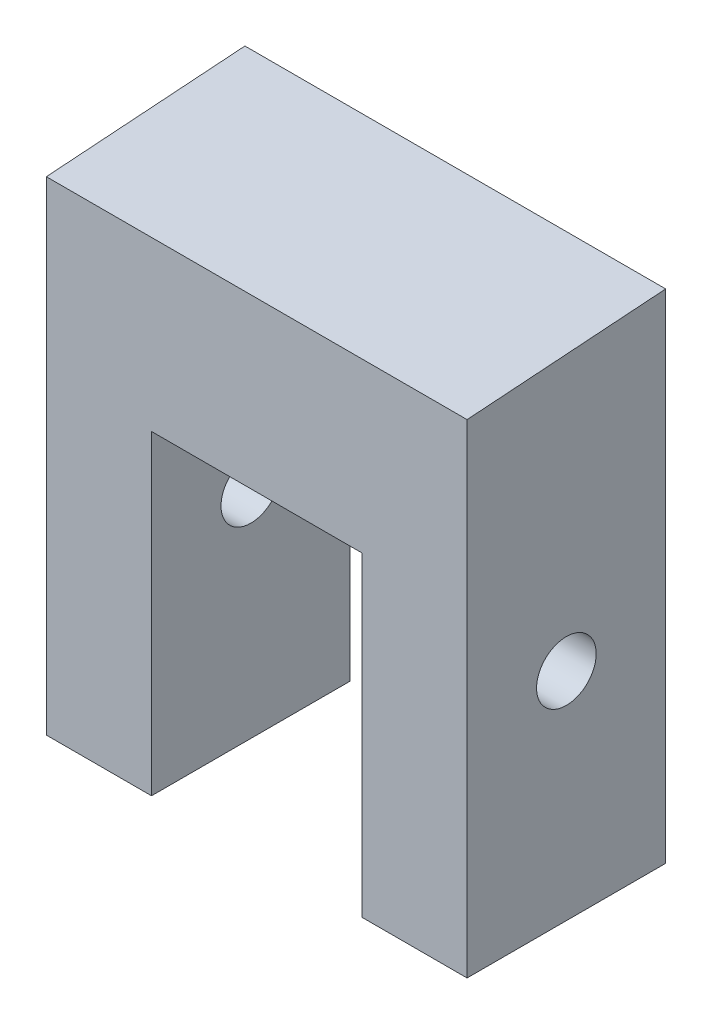
ISO-10303-21;
HEADER;
FILE_DESCRIPTION(('STEP AP214'),'2;1');
FILE_NAME('part.step','',(''),(''),'','','');
FILE_SCHEMA(('AUTOMOTIVE_DESIGN { 1 0 10303 214 1 1 1 1 }'));
ENDSEC;
DATA;
#1=APPLICATION_CONTEXT('core data for automotive mechanical design processes');
#2=APPLICATION_PROTOCOL_DEFINITION('international standard','automotive_design',2000,#1);
#3=PRODUCT_CONTEXT('',#1,'mechanical');
#4=PRODUCT('Part','Part','',(#3));
#5=PRODUCT_RELATED_PRODUCT_CATEGORY('part','',(#4));
#6=PRODUCT_DEFINITION_FORMATION('','',#4);
#7=PRODUCT_DEFINITION_CONTEXT('part definition',#1,'design');
#8=PRODUCT_DEFINITION('design','',#6,#7);
#9=PRODUCT_DEFINITION_SHAPE('','',#8);
#10=(LENGTH_UNIT() NAMED_UNIT(*) SI_UNIT(.MILLI.,.METRE.));
#11=(NAMED_UNIT(*) PLANE_ANGLE_UNIT() SI_UNIT($,.RADIAN.));
#12=(NAMED_UNIT(*) SI_UNIT($,.STERADIAN.) SOLID_ANGLE_UNIT());
#13=UNCERTAINTY_MEASURE_WITH_UNIT(LENGTH_MEASURE(1.E-05),#10,'distance_accuracy_value','');
#14=(GEOMETRIC_REPRESENTATION_CONTEXT(3) GLOBAL_UNCERTAINTY_ASSIGNED_CONTEXT((#13)) GLOBAL_UNIT_ASSIGNED_CONTEXT((#10,
#11,#12)) REPRESENTATION_CONTEXT('',''));
#15=CARTESIAN_POINT('',(0.,0.,0.));
#16=DIRECTION('',(0.,0.,1.));
#17=DIRECTION('',(1.,0.,0.));
#18=AXIS2_PLACEMENT_3D('',#15,#16,#17);
#19=CARTESIAN_POINT('',(25.4,0.,0.));
#20=DIRECTION('',(0.,1.,0.));
#21=DIRECTION('',(0.,0.,1.));
#22=AXIS2_PLACEMENT_3D('',#19,#20,#21);
#23=PLANE('',#22);
#24=DIRECTION('',(-1.,0.,0.));
#25=VECTOR('',#24,1.);
#26=CARTESIAN_POINT('',(25.4,0.,0.));
#27=LINE('',#26,#25);
#28=CARTESIAN_POINT('',(25.4,0.,0.));
#29=VERTEX_POINT('',#28);
#30=CARTESIAN_POINT('',(19.05,0.,0.));
#31=VERTEX_POINT('',#30);
#32=EDGE_CURVE('E11',#29,#31,#27,.T.);
#33=ORIENTED_EDGE('',*,*,#32,.T.);
#34=DIRECTION('',(0.,0.,1.));
#35=VECTOR('',#34,1.);
#36=CARTESIAN_POINT('',(19.05,0.,-11.9888));
#37=LINE('',#36,#35);
#38=CARTESIAN_POINT('',(19.05,0.,-11.9888));
#39=VERTEX_POINT('',#38);
#40=EDGE_CURVE('E153',#39,#31,#37,.T.);
#41=ORIENTED_EDGE('',*,*,#40,.F.);
#42=DIRECTION('',(-1.,0.,0.));
#43=VECTOR('',#42,1.);
#44=CARTESIAN_POINT('',(25.4,0.,-11.9888));
#45=LINE('',#44,#43);
#46=CARTESIAN_POINT('',(25.4,0.,-11.9888));
#47=VERTEX_POINT('',#46);
#48=EDGE_CURVE('E136',#47,#39,#45,.T.);
#49=ORIENTED_EDGE('',*,*,#48,.F.);
#50=DIRECTION('',(0.,0.,-1.));
#51=VECTOR('',#50,1.);
#52=CARTESIAN_POINT('',(25.4,0.,0.));
#53=LINE('',#52,#51);
#54=EDGE_CURVE('E92',#29,#47,#53,.T.);
#55=ORIENTED_EDGE('',*,*,#54,.F.);
#56=EDGE_LOOP('',(#33,#41,#49,#55));
#57=FACE_BOUND('',#56,.T.);
#58=ADVANCED_FACE('F39',(#57),#23,.F.);
#59=CARTESIAN_POINT('',(25.4,29.1944437645599,0.));
#60=DIRECTION('',(0.,0.,-1.));
#61=DIRECTION('',(0.,1.,0.));
#62=AXIS2_PLACEMENT_3D('',#59,#60,#61);
#63=PLANE('',#62);
#64=DIRECTION('',(-1.,0.,0.));
#65=VECTOR('',#64,1.);
#66=CARTESIAN_POINT('',(6.34999999999999,19.05,0.));
#67=LINE('',#66,#65);
#68=CARTESIAN_POINT('',(19.05,19.05,0.));
#69=VERTEX_POINT('',#68);
#70=CARTESIAN_POINT('',(6.34999999999999,19.05,0.));
#71=VERTEX_POINT('',#70);
#72=EDGE_CURVE('E141',#69,#71,#67,.T.);
#73=ORIENTED_EDGE('',*,*,#72,.F.);
#74=DIRECTION('',(0.,1.,0.));
#75=VECTOR('',#74,1.);
#76=CARTESIAN_POINT('',(19.05,19.05,0.));
#77=LINE('',#76,#75);
#78=EDGE_CURVE('E120',#31,#69,#77,.T.);
#79=ORIENTED_EDGE('',*,*,#78,.F.);
#80=ORIENTED_EDGE('',*,*,#32,.F.);
#81=DIRECTION('',(0.,-1.,0.));
#82=VECTOR('',#81,1.);
#83=CARTESIAN_POINT('',(25.4,29.1944437645599,0.));
#84=LINE('',#83,#82);
#85=CARTESIAN_POINT('',(25.4,29.1944437645599,0.));
#86=VERTEX_POINT('',#85);
#87=EDGE_CURVE('E163',#86,#29,#84,.T.);
#88=ORIENTED_EDGE('',*,*,#87,.F.);
#89=DIRECTION('',(-1.,0.,0.));
#90=VECTOR('',#89,1.);
#91=CARTESIAN_POINT('',(25.4,29.1944437645599,0.));
#92=LINE('',#91,#90);
#93=CARTESIAN_POINT('',(0.,29.1944437645599,0.));
#94=VERTEX_POINT('',#93);
#95=EDGE_CURVE('E173',#86,#94,#92,.T.);
#96=ORIENTED_EDGE('',*,*,#95,.T.);
#97=DIRECTION('',(0.,-1.,0.));
#98=VECTOR('',#97,1.);
#99=CARTESIAN_POINT('',(0.,29.1944437645599,0.));
#100=LINE('',#99,#98);
#101=CARTESIAN_POINT('',(0.,0.,0.));
#102=VERTEX_POINT('',#101);
#103=EDGE_CURVE('E156',#94,#102,#100,.T.);
#104=ORIENTED_EDGE('',*,*,#103,.T.);
#105=CARTESIAN_POINT('',(6.35,0.,0.));
#106=VERTEX_POINT('',#105);
#107=EDGE_CURVE('E48',#106,#102,#27,.T.);
#108=ORIENTED_EDGE('',*,*,#107,.F.);
#109=DIRECTION('',(0.,-1.,0.));
#110=VECTOR('',#109,1.);
#111=CARTESIAN_POINT('',(6.34999999999999,19.05,0.));
#112=LINE('',#111,#110);
#113=EDGE_CURVE('E138',#71,#106,#112,.T.);
#114=ORIENTED_EDGE('',*,*,#113,.F.);
#115=EDGE_LOOP('',(#73,#79,#80,#88,#96,#104,#108,#114));
#116=FACE_BOUND('',#115,.T.);
#117=ADVANCED_FACE('F41',(#116),#63,.F.);
#118=CARTESIAN_POINT('',(6.35,0.,-11.9888));
#119=VERTEX_POINT('',#118);
#120=CARTESIAN_POINT('',(0.,0.,-11.9888));
#121=VERTEX_POINT('',#120);
#122=EDGE_CURVE('E190',#119,#121,#45,.T.);
#123=ORIENTED_EDGE('',*,*,#122,.F.);
#124=DIRECTION('',(0.,0.,1.));
#125=VECTOR('',#124,1.);
#126=CARTESIAN_POINT('',(6.35,0.,-11.9888));
#127=LINE('',#126,#125);
#128=EDGE_CURVE('E157',#119,#106,#127,.T.);
#129=ORIENTED_EDGE('',*,*,#128,.T.);
#130=ORIENTED_EDGE('',*,*,#107,.T.);
#131=DIRECTION('',(0.,0.,-1.));
#132=VECTOR('',#131,1.);
#133=CARTESIAN_POINT('',(0.,0.,0.));
#134=LINE('',#133,#132);
#135=EDGE_CURVE('E177',#102,#121,#134,.T.);
#136=ORIENTED_EDGE('',*,*,#135,.T.);
#137=EDGE_LOOP('',(#123,#129,#130,#136));
#138=FACE_BOUND('',#137,.T.);
#139=ADVANCED_FACE('F199',(#138),#23,.F.);
#140=CARTESIAN_POINT('',(25.4,0.,-11.9888));
#141=DIRECTION('',(0.,0.,1.));
#142=DIRECTION('',(1.,0.,0.));
#143=AXIS2_PLACEMENT_3D('',#140,#141,#142);
#144=PLANE('',#143);
#145=ORIENTED_EDGE('',*,*,#48,.T.);
#146=DIRECTION('',(0.,1.,0.));
#147=VECTOR('',#146,1.);
#148=CARTESIAN_POINT('',(19.05,19.05,-11.9888));
#149=LINE('',#148,#147);
#150=CARTESIAN_POINT('',(19.05,19.05,-11.9888));
#151=VERTEX_POINT('',#150);
#152=EDGE_CURVE('E117',#39,#151,#149,.T.);
#153=ORIENTED_EDGE('',*,*,#152,.T.);
#154=DIRECTION('',(-1.,0.,0.));
#155=VECTOR('',#154,1.);
#156=CARTESIAN_POINT('',(6.34999999999999,19.05,-11.9888));
#157=LINE('',#156,#155);
#158=CARTESIAN_POINT('',(6.34999999999999,19.05,-11.9888));
#159=VERTEX_POINT('',#158);
#160=EDGE_CURVE('E128',#151,#159,#157,.T.);
#161=ORIENTED_EDGE('',*,*,#160,.T.);
#162=DIRECTION('',(0.,-1.,0.));
#163=VECTOR('',#162,1.);
#164=CARTESIAN_POINT('',(6.34999999999999,19.05,-11.9888));
#165=LINE('',#164,#163);
#166=EDGE_CURVE('E55',#159,#119,#165,.T.);
#167=ORIENTED_EDGE('',*,*,#166,.T.);
#168=ORIENTED_EDGE('',*,*,#122,.T.);
#169=DIRECTION('',(0.,1.,0.));
#170=VECTOR('',#169,1.);
#171=CARTESIAN_POINT('',(0.,0.,-11.9888));
#172=LINE('',#171,#170);
#173=CARTESIAN_POINT('',(0.,30.0327823275882,-11.9888));
#174=VERTEX_POINT('',#173);
#175=EDGE_CURVE('E181',#121,#174,#172,.T.);
#176=ORIENTED_EDGE('',*,*,#175,.T.);
#177=DIRECTION('',(-1.,0.,0.));
#178=VECTOR('',#177,1.);
#179=CARTESIAN_POINT('',(25.4,30.0327823275882,-11.9888));
#180=LINE('',#179,#178);
#181=CARTESIAN_POINT('',(25.4,30.0327823275882,-11.9888));
#182=VERTEX_POINT('',#181);
#183=EDGE_CURVE('E188',#182,#174,#180,.T.);
#184=ORIENTED_EDGE('',*,*,#183,.F.);
#185=DIRECTION('',(0.,1.,0.));
#186=VECTOR('',#185,1.);
#187=CARTESIAN_POINT('',(25.4,0.,-11.9888));
#188=LINE('',#187,#186);
#189=EDGE_CURVE('E168',#47,#182,#188,.T.);
#190=ORIENTED_EDGE('',*,*,#189,.F.);
#191=EDGE_LOOP('',(#145,#153,#161,#167,#168,#176,#184,#190));
#192=FACE_BOUND('',#191,.T.);
#193=ADVANCED_FACE('F134',(#192),#144,.F.);
#194=CARTESIAN_POINT('',(25.4,30.0327823275882,-11.9888));
#195=DIRECTION('',(0.,-0.997564050259825,-0.0697564737441184));
#196=DIRECTION('',(0.,0.0697564737441184,-0.997564050259825));
#197=AXIS2_PLACEMENT_3D('',#194,#195,#196);
#198=PLANE('',#197);
#199=DIRECTION('',(0.,-0.0697564737441184,0.997564050259825));
#200=VECTOR('',#199,1.);
#201=CARTESIAN_POINT('',(0.,30.0327823275882,-11.9888));
#202=LINE('',#201,#200);
#203=EDGE_CURVE('E85',#174,#94,#202,.T.);
#204=ORIENTED_EDGE('',*,*,#203,.T.);
#205=ORIENTED_EDGE('',*,*,#95,.F.);
#206=DIRECTION('',(0.,-0.0697564737441184,0.997564050259825));
#207=VECTOR('',#206,1.);
#208=CARTESIAN_POINT('',(25.4,30.0327823275882,-11.9888));
#209=LINE('',#208,#207);
#210=EDGE_CURVE('E64',#182,#86,#209,.T.);
#211=ORIENTED_EDGE('',*,*,#210,.F.);
#212=ORIENTED_EDGE('',*,*,#183,.T.);
#213=EDGE_LOOP('',(#204,#205,#211,#212));
#214=FACE_BOUND('',#213,.T.);
#215=ADVANCED_FACE('F208',(#214),#198,.F.);
#216=CARTESIAN_POINT('',(25.4,0.,0.));
#217=DIRECTION('',(1.,0.,0.));
#218=DIRECTION('',(0.,0.,-1.));
#219=AXIS2_PLACEMENT_3D('',#216,#217,#218);
#220=PLANE('',#219);
#221=CARTESIAN_POINT('',(25.4,13.0556,-5.9944));
#222=DIRECTION('',(1.,0.,0.));
#223=DIRECTION('',(0.,0.,-1.));
#224=AXIS2_PLACEMENT_3D('',#221,#222,#223);
#225=CIRCLE('',#224,1.79999999999999);
#226=CARTESIAN_POINT('',(25.4,13.0556,-7.79439999999999));
#227=VERTEX_POINT('',#226);
#228=EDGE_CURVE('E247',#227,#227,#225,.T.);
#229=ORIENTED_EDGE('',*,*,#228,.F.);
#230=EDGE_LOOP('',(#229));
#231=FACE_BOUND('',#230,.T.);
#232=ORIENTED_EDGE('',*,*,#87,.T.);
#233=ORIENTED_EDGE('',*,*,#54,.T.);
#234=ORIENTED_EDGE('',*,*,#189,.T.);
#235=ORIENTED_EDGE('',*,*,#210,.T.);
#236=EDGE_LOOP('',(#232,#233,#234,#235));
#237=FACE_BOUND('',#236,.T.);
#238=ADVANCED_FACE('F209',(#231,#237),#220,.T.);
#239=CARTESIAN_POINT('',(0.,0.,0.));
#240=DIRECTION('',(1.,0.,0.));
#241=DIRECTION('',(0.,0.,-1.));
#242=AXIS2_PLACEMENT_3D('',#239,#240,#241);
#243=PLANE('',#242);
#244=CARTESIAN_POINT('',(0.,13.0556,-5.9944));
#245=DIRECTION('',(1.,0.,0.));
#246=DIRECTION('',(0.,0.,-1.));
#247=AXIS2_PLACEMENT_3D('',#244,#245,#246);
#248=CIRCLE('',#247,1.79999999999999);
#249=CARTESIAN_POINT('',(0.,13.0556,-7.79439999999999));
#250=VERTEX_POINT('',#249);
#251=EDGE_CURVE('E250',#250,#250,#248,.T.);
#252=ORIENTED_EDGE('',*,*,#251,.T.);
#253=EDGE_LOOP('',(#252));
#254=FACE_BOUND('',#253,.T.);
#255=ORIENTED_EDGE('',*,*,#103,.F.);
#256=ORIENTED_EDGE('',*,*,#203,.F.);
#257=ORIENTED_EDGE('',*,*,#175,.F.);
#258=ORIENTED_EDGE('',*,*,#135,.F.);
#259=EDGE_LOOP('',(#255,#256,#257,#258));
#260=FACE_BOUND('',#259,.T.);
#261=ADVANCED_FACE('F203',(#254,#260),#243,.F.);
#262=CARTESIAN_POINT('',(19.05,19.05,-11.9888));
#263=DIRECTION('',(1.,0.,0.));
#264=DIRECTION('',(0.,1.,0.));
#265=AXIS2_PLACEMENT_3D('',#262,#263,#264);
#266=PLANE('',#265);
#267=CARTESIAN_POINT('',(19.05,13.0556,-5.9944));
#268=DIRECTION('',(1.,0.,0.));
#269=DIRECTION('',(0.,1.,0.));
#270=AXIS2_PLACEMENT_3D('',#267,#268,#269);
#271=CIRCLE('',#270,1.79999999999999);
#272=CARTESIAN_POINT('',(19.05,14.8556,-5.9944));
#273=VERTEX_POINT('',#272);
#274=EDGE_CURVE('E254',#273,#273,#271,.T.);
#275=ORIENTED_EDGE('',*,*,#274,.T.);
#276=EDGE_LOOP('',(#275));
#277=FACE_BOUND('',#276,.T.);
#278=ORIENTED_EDGE('',*,*,#78,.T.);
#279=DIRECTION('',(0.,0.,1.));
#280=VECTOR('',#279,1.);
#281=CARTESIAN_POINT('',(19.05,19.05,-11.9888));
#282=LINE('',#281,#280);
#283=EDGE_CURVE('E113',#151,#69,#282,.T.);
#284=ORIENTED_EDGE('',*,*,#283,.F.);
#285=ORIENTED_EDGE('',*,*,#152,.F.);
#286=ORIENTED_EDGE('',*,*,#40,.T.);
#287=EDGE_LOOP('',(#278,#284,#285,#286));
#288=FACE_BOUND('',#287,.T.);
#289=ADVANCED_FACE('F115',(#277,#288),#266,.F.);
#290=CARTESIAN_POINT('',(6.34999999999999,19.05,-11.9888));
#291=DIRECTION('',(-1.,0.,0.));
#292=DIRECTION('',(0.,-1.,0.));
#293=AXIS2_PLACEMENT_3D('',#290,#291,#292);
#294=PLANE('',#293);
#295=CARTESIAN_POINT('',(6.34999999999999,13.0556,-5.9944));
#296=DIRECTION('',(-1.,0.,0.));
#297=DIRECTION('',(0.,-1.,0.));
#298=AXIS2_PLACEMENT_3D('',#295,#296,#297);
#299=CIRCLE('',#298,1.79999999999999);
#300=CARTESIAN_POINT('',(6.34999999999999,11.2556,-5.9944));
#301=VERTEX_POINT('',#300);
#302=EDGE_CURVE('E144',#301,#301,#299,.T.);
#303=ORIENTED_EDGE('',*,*,#302,.T.);
#304=EDGE_LOOP('',(#303));
#305=FACE_BOUND('',#304,.T.);
#306=ORIENTED_EDGE('',*,*,#113,.T.);
#307=ORIENTED_EDGE('',*,*,#128,.F.);
#308=ORIENTED_EDGE('',*,*,#166,.F.);
#309=DIRECTION('',(0.,0.,1.));
#310=VECTOR('',#309,1.);
#311=CARTESIAN_POINT('',(6.34999999999999,19.05,-11.9888));
#312=LINE('',#311,#310);
#313=EDGE_CURVE('E125',#159,#71,#312,.T.);
#314=ORIENTED_EDGE('',*,*,#313,.T.);
#315=EDGE_LOOP('',(#306,#307,#308,#314));
#316=FACE_BOUND('',#315,.T.);
#317=ADVANCED_FACE('F210',(#305,#316),#294,.F.);
#318=CARTESIAN_POINT('',(6.34999999999999,19.05,-11.9888));
#319=DIRECTION('',(0.,1.,0.));
#320=DIRECTION('',(-1.,0.,0.));
#321=AXIS2_PLACEMENT_3D('',#318,#319,#320);
#322=PLANE('',#321);
#323=ORIENTED_EDGE('',*,*,#72,.T.);
#324=ORIENTED_EDGE('',*,*,#313,.F.);
#325=ORIENTED_EDGE('',*,*,#160,.F.);
#326=ORIENTED_EDGE('',*,*,#283,.T.);
#327=EDGE_LOOP('',(#323,#324,#325,#326));
#328=FACE_BOUND('',#327,.T.);
#329=ADVANCED_FACE('F129',(#328),#322,.F.);
#330=CARTESIAN_POINT('',(25.4,13.0556,-5.9944));
#331=DIRECTION('',(1.,0.,0.));
#332=DIRECTION('',(0.,0.,-1.));
#333=AXIS2_PLACEMENT_3D('',#330,#331,#332);
#334=CYLINDRICAL_SURFACE('',#333,1.79999999999999);
#335=ORIENTED_EDGE('',*,*,#251,.F.);
#336=EDGE_LOOP('',(#335));
#337=FACE_BOUND('',#336,.T.);
#338=ORIENTED_EDGE('',*,*,#302,.F.);
#339=EDGE_LOOP('',(#338));
#340=FACE_BOUND('',#339,.T.);
#341=ADVANCED_FACE('F218',(#337,#340),#334,.F.);
#342=ORIENTED_EDGE('',*,*,#228,.T.);
#343=EDGE_LOOP('',(#342));
#344=FACE_BOUND('',#343,.T.);
#345=ORIENTED_EDGE('',*,*,#274,.F.);
#346=EDGE_LOOP('',(#345));
#347=FACE_BOUND('',#346,.T.);
#348=ADVANCED_FACE('F263',(#344,#347),#334,.F.);
#349=CLOSED_SHELL('',(#58,#117,#139,#193,#215,#238,#261,#289,#317,#329,#341,#348));
#350=MANIFOLD_SOLID_BREP('B2',#349);
#351=ADVANCED_BREP_SHAPE_REPRESENTATION('',(#18,#350),#14);
#352=SHAPE_DEFINITION_REPRESENTATION(#9,#351);
ENDSEC;
END-ISO-10303-21;
